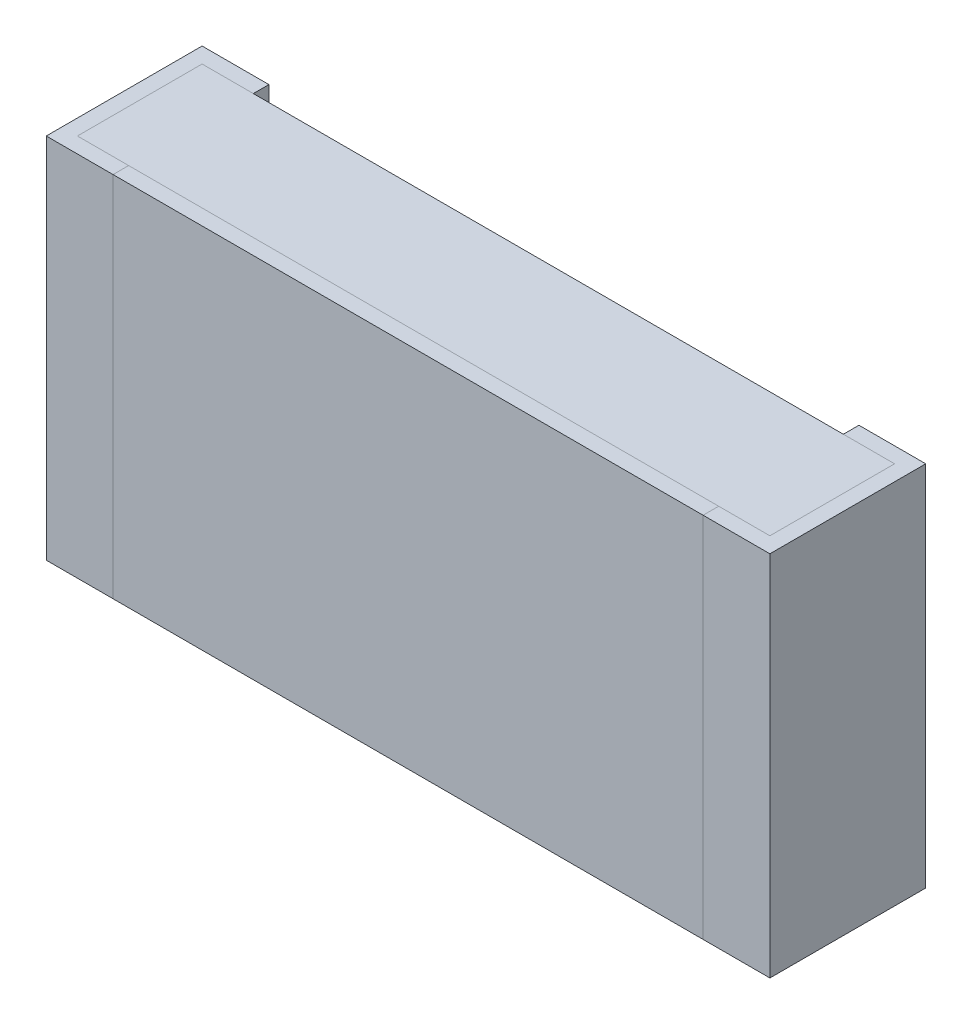
ISO-10303-21;
HEADER;
FILE_DESCRIPTION(('STEP AP214'),'2;1');
FILE_NAME('part.step','',(''),(''),'','','');
FILE_SCHEMA(('AUTOMOTIVE_DESIGN { 1 0 10303 214 1 1 1 1 }'));
ENDSEC;
DATA;
#1=APPLICATION_CONTEXT('core data for automotive mechanical design processes');
#2=APPLICATION_PROTOCOL_DEFINITION('international standard','automotive_design',2000,#1);
#3=PRODUCT_CONTEXT('',#1,'mechanical');
#4=PRODUCT('Part','Part','',(#3));
#5=PRODUCT_RELATED_PRODUCT_CATEGORY('part','',(#4));
#6=PRODUCT_DEFINITION_FORMATION('','',#4);
#7=PRODUCT_DEFINITION_CONTEXT('part definition',#1,'design');
#8=PRODUCT_DEFINITION('design','',#6,#7);
#9=PRODUCT_DEFINITION_SHAPE('','',#8);
#10=(LENGTH_UNIT() NAMED_UNIT(*) SI_UNIT(.MILLI.,.METRE.));
#11=(NAMED_UNIT(*) PLANE_ANGLE_UNIT() SI_UNIT($,.RADIAN.));
#12=(NAMED_UNIT(*) SI_UNIT($,.STERADIAN.) SOLID_ANGLE_UNIT());
#13=UNCERTAINTY_MEASURE_WITH_UNIT(LENGTH_MEASURE(1.E-05),#10,'distance_accuracy_value','');
#14=(GEOMETRIC_REPRESENTATION_CONTEXT(3) GLOBAL_UNCERTAINTY_ASSIGNED_CONTEXT((#13)) GLOBAL_UNIT_ASSIGNED_CONTEXT((#10,
#11,#12)) REPRESENTATION_CONTEXT('',''));
#15=CARTESIAN_POINT('',(0.,0.,0.));
#16=DIRECTION('',(0.,0.,1.));
#17=DIRECTION('',(1.,0.,0.));
#18=AXIS2_PLACEMENT_3D('',#15,#16,#17);
#19=CARTESIAN_POINT('',(-1.55483744,-0.900915519999999,0.07));
#20=DIRECTION('',(1.,0.,0.));
#21=DIRECTION('',(0.,0.,1.));
#22=AXIS2_PLACEMENT_3D('',#19,#20,#21);
#23=PLANE('',#22);
#24=DIRECTION('',(0.,1.,0.));
#25=VECTOR('',#24,1.);
#26=CARTESIAN_POINT('',(-1.55483744,-0.900915519999999,0.63));
#27=LINE('',#26,#25);
#28=CARTESIAN_POINT('',(-1.55483744,-0.900915519999999,0.63));
#29=VERTEX_POINT('',#28);
#30=CARTESIAN_POINT('',(-1.55483744,0.74908448,0.63));
#31=VERTEX_POINT('',#30);
#32=EDGE_CURVE('P0_E11',#29,#31,#27,.T.);
#33=ORIENTED_EDGE('',*,*,#32,.T.);
#34=DIRECTION('',(0.,0.,1.));
#35=VECTOR('',#34,1.);
#36=CARTESIAN_POINT('',(-1.55483744,0.74908448,0.07));
#37=LINE('',#36,#35);
#38=CARTESIAN_POINT('',(-1.55483744,0.74908448,0.07));
#39=VERTEX_POINT('',#38);
#40=EDGE_CURVE('P0_E24',#39,#31,#37,.T.);
#41=ORIENTED_EDGE('',*,*,#40,.F.);
#42=DIRECTION('',(0.,1.,0.));
#43=VECTOR('',#42,1.);
#44=CARTESIAN_POINT('',(-1.55483744,-0.900915519999999,0.07));
#45=LINE('',#44,#43);
#46=CARTESIAN_POINT('',(-1.55483744,-0.900915519999999,0.07));
#47=VERTEX_POINT('',#46);
#48=EDGE_CURVE('P0_E86',#47,#39,#45,.T.);
#49=ORIENTED_EDGE('',*,*,#48,.F.);
#50=DIRECTION('',(0.,0.,1.));
#51=VECTOR('',#50,1.);
#52=CARTESIAN_POINT('',(-1.55483744,-0.900915519999999,0.07));
#53=LINE('',#52,#51);
#54=EDGE_CURVE('P0_E36',#47,#29,#53,.T.);
#55=ORIENTED_EDGE('',*,*,#54,.T.);
#56=EDGE_LOOP('',(#33,#41,#49,#55));
#57=FACE_BOUND('',#56,.T.);
#58=ADVANCED_FACE('P0_F17',(#57),#23,.F.);
#59=CARTESIAN_POINT('',(1.55516256,-0.90091552,0.07));
#60=DIRECTION('',(1.,0.,0.));
#61=DIRECTION('',(0.,0.,1.));
#62=AXIS2_PLACEMENT_3D('',#59,#60,#61);
#63=PLANE('',#62);
#64=DIRECTION('',(0.,0.,1.));
#65=VECTOR('',#64,1.);
#66=CARTESIAN_POINT('',(1.55516256,-0.90091552,0.07));
#67=LINE('',#66,#65);
#68=CARTESIAN_POINT('',(1.55516256,-0.90091552,0.07));
#69=VERTEX_POINT('',#68);
#70=CARTESIAN_POINT('',(1.55516256,-0.90091552,0.63));
#71=VERTEX_POINT('',#70);
#72=EDGE_CURVE('P0_E83',#69,#71,#67,.T.);
#73=ORIENTED_EDGE('',*,*,#72,.F.);
#74=DIRECTION('',(0.,1.,0.));
#75=VECTOR('',#74,1.);
#76=CARTESIAN_POINT('',(1.55516256,-0.90091552,0.07));
#77=LINE('',#76,#75);
#78=CARTESIAN_POINT('',(1.55516256,0.74908448,0.07));
#79=VERTEX_POINT('',#78);
#80=EDGE_CURVE('P0_E63',#69,#79,#77,.T.);
#81=ORIENTED_EDGE('',*,*,#80,.T.);
#82=DIRECTION('',(0.,0.,1.));
#83=VECTOR('',#82,1.);
#84=CARTESIAN_POINT('',(1.55516256,0.74908448,0.07));
#85=LINE('',#84,#83);
#86=CARTESIAN_POINT('',(1.55516256,0.74908448,0.63));
#87=VERTEX_POINT('',#86);
#88=EDGE_CURVE('P0_E57',#79,#87,#85,.T.);
#89=ORIENTED_EDGE('',*,*,#88,.T.);
#90=DIRECTION('',(0.,1.,0.));
#91=VECTOR('',#90,1.);
#92=CARTESIAN_POINT('',(1.55516256,-0.90091552,0.63));
#93=LINE('',#92,#91);
#94=EDGE_CURVE('P0_E60',#71,#87,#93,.T.);
#95=ORIENTED_EDGE('',*,*,#94,.F.);
#96=EDGE_LOOP('',(#73,#81,#89,#95));
#97=FACE_BOUND('',#96,.T.);
#98=ADVANCED_FACE('P0_F59',(#97),#63,.T.);
#99=CARTESIAN_POINT('',(-1.55483744,-0.900915519999999,0.07));
#100=DIRECTION('',(0.,1.,0.));
#101=DIRECTION('',(0.,0.,1.));
#102=AXIS2_PLACEMENT_3D('',#99,#100,#101);
#103=PLANE('',#102);
#104=ORIENTED_EDGE('',*,*,#72,.T.);
#105=DIRECTION('',(1.,0.,0.));
#106=VECTOR('',#105,1.);
#107=CARTESIAN_POINT('',(-1.55483744,-0.900915519999999,0.63));
#108=LINE('',#107,#106);
#109=EDGE_CURVE('P0_E71',#29,#71,#108,.T.);
#110=ORIENTED_EDGE('',*,*,#109,.F.);
#111=ORIENTED_EDGE('',*,*,#54,.F.);
#112=DIRECTION('',(1.,0.,0.));
#113=VECTOR('',#112,1.);
#114=CARTESIAN_POINT('',(-1.55483744,-0.900915519999999,0.07));
#115=LINE('',#114,#113);
#116=EDGE_CURVE('P0_E76',#47,#69,#115,.T.);
#117=ORIENTED_EDGE('',*,*,#116,.T.);
#118=EDGE_LOOP('',(#104,#110,#111,#117));
#119=FACE_BOUND('',#118,.T.);
#120=ADVANCED_FACE('P0_F91',(#119),#103,.F.);
#121=CARTESIAN_POINT('',(-1.55483744,0.74908448,0.07));
#122=DIRECTION('',(0.,1.,0.));
#123=DIRECTION('',(0.,0.,1.));
#124=AXIS2_PLACEMENT_3D('',#121,#122,#123);
#125=PLANE('',#124);
#126=DIRECTION('',(1.,0.,0.));
#127=VECTOR('',#126,1.);
#128=CARTESIAN_POINT('',(-1.55483744,0.74908448,0.07));
#129=LINE('',#128,#127);
#130=EDGE_CURVE('P0_E74',#39,#79,#129,.T.);
#131=ORIENTED_EDGE('',*,*,#130,.F.);
#132=ORIENTED_EDGE('',*,*,#40,.T.);
#133=DIRECTION('',(1.,0.,0.));
#134=VECTOR('',#133,1.);
#135=CARTESIAN_POINT('',(-1.55483744,0.74908448,0.63));
#136=LINE('',#135,#134);
#137=EDGE_CURVE('P0_E69',#31,#87,#136,.T.);
#138=ORIENTED_EDGE('',*,*,#137,.T.);
#139=ORIENTED_EDGE('',*,*,#88,.F.);
#140=EDGE_LOOP('',(#131,#132,#138,#139));
#141=FACE_BOUND('',#140,.T.);
#142=ADVANCED_FACE('P0_F73',(#141),#125,.T.);
#143=CARTESIAN_POINT('',(-1.55483744,-0.900915519999999,0.07));
#144=DIRECTION('',(0.,0.,1.));
#145=DIRECTION('',(1.,0.,0.));
#146=AXIS2_PLACEMENT_3D('',#143,#144,#145);
#147=PLANE('',#146);
#148=ORIENTED_EDGE('',*,*,#130,.T.);
#149=ORIENTED_EDGE('',*,*,#80,.F.);
#150=ORIENTED_EDGE('',*,*,#116,.F.);
#151=ORIENTED_EDGE('',*,*,#48,.T.);
#152=EDGE_LOOP('',(#148,#149,#150,#151));
#153=FACE_BOUND('',#152,.T.);
#154=ADVANCED_FACE('P0_F89',(#153),#147,.F.);
#155=CARTESIAN_POINT('',(-1.55483744,-0.900915519999999,0.63));
#156=DIRECTION('',(0.,0.,1.));
#157=DIRECTION('',(1.,0.,0.));
#158=AXIS2_PLACEMENT_3D('',#155,#156,#157);
#159=PLANE('',#158);
#160=ORIENTED_EDGE('',*,*,#32,.F.);
#161=ORIENTED_EDGE('',*,*,#109,.T.);
#162=ORIENTED_EDGE('',*,*,#94,.T.);
#163=ORIENTED_EDGE('',*,*,#137,.F.);
#164=EDGE_LOOP('',(#160,#161,#162,#163));
#165=FACE_BOUND('',#164,.T.);
#166=ADVANCED_FACE('P0_F68',(#165),#159,.T.);
#167=CLOSED_SHELL('',(#58,#98,#120,#142,#154,#166));
#168=MANIFOLD_SOLID_BREP('P0_B1',#167);
#169=CARTESIAN_POINT('',(-1.62483744,-0.900915519999999,0.));
#170=DIRECTION('',(1.,0.,0.));
#171=DIRECTION('',(0.,0.,1.));
#172=AXIS2_PLACEMENT_3D('',#169,#170,#171);
#173=PLANE('',#172);
#174=DIRECTION('',(0.,1.,0.));
#175=VECTOR('',#174,1.);
#176=CARTESIAN_POINT('',(-1.62483744,-0.900915519999999,0.7));
#177=LINE('',#176,#175);
#178=CARTESIAN_POINT('',(-1.62483744,-0.900915519999999,0.7));
#179=VERTEX_POINT('',#178);
#180=CARTESIAN_POINT('',(-1.62483744,0.74908448,0.7));
#181=VERTEX_POINT('',#180);
#182=EDGE_CURVE('P1_E11',#179,#181,#177,.T.);
#183=ORIENTED_EDGE('',*,*,#182,.T.);
#184=DIRECTION('',(0.,0.,1.));
#185=VECTOR('',#184,1.);
#186=CARTESIAN_POINT('',(-1.62483744,0.74908448,0.));
#187=LINE('',#186,#185);
#188=CARTESIAN_POINT('',(-1.62483744,0.74908448,0.));
#189=VERTEX_POINT('',#188);
#190=EDGE_CURVE('P1_E24',#189,#181,#187,.T.);
#191=ORIENTED_EDGE('',*,*,#190,.F.);
#192=DIRECTION('',(0.,1.,0.));
#193=VECTOR('',#192,1.);
#194=CARTESIAN_POINT('',(-1.62483744,-0.900915519999999,0.));
#195=LINE('',#194,#193);
#196=CARTESIAN_POINT('',(-1.62483744,-0.900915519999999,0.));
#197=VERTEX_POINT('',#196);
#198=EDGE_CURVE('P1_E138',#197,#189,#195,.T.);
#199=ORIENTED_EDGE('',*,*,#198,.F.);
#200=DIRECTION('',(0.,0.,1.));
#201=VECTOR('',#200,1.);
#202=CARTESIAN_POINT('',(-1.62483744,-0.900915519999999,0.));
#203=LINE('',#202,#201);
#204=EDGE_CURVE('P1_E37',#197,#179,#203,.T.);
#205=ORIENTED_EDGE('',*,*,#204,.T.);
#206=EDGE_LOOP('',(#183,#191,#199,#205));
#207=FACE_BOUND('',#206,.T.);
#208=ADVANCED_FACE('P1_F17',(#207),#173,.F.);
#209=CARTESIAN_POINT('',(-1.62483744,-0.900915519999999,0.));
#210=DIRECTION('',(0.,1.,0.));
#211=DIRECTION('',(0.,0.,1.));
#212=AXIS2_PLACEMENT_3D('',#209,#210,#211);
#213=PLANE('',#212);
#214=DIRECTION('',(1.,0.,0.));
#215=VECTOR('',#214,1.);
#216=CARTESIAN_POINT('',(-1.55483744,-0.900915519999999,0.07));
#217=LINE('',#216,#215);
#218=CARTESIAN_POINT('',(-1.55483744,-0.900915519999999,0.07));
#219=VERTEX_POINT('',#218);
#220=CARTESIAN_POINT('',(-1.32483744,-0.90091552,0.07));
#221=VERTEX_POINT('',#220);
#222=EDGE_CURVE('P1_E135',#219,#221,#217,.T.);
#223=ORIENTED_EDGE('',*,*,#222,.F.);
#224=DIRECTION('',(0.,0.,1.));
#225=VECTOR('',#224,1.);
#226=CARTESIAN_POINT('',(-1.55483744,-0.900915519999999,0.07));
#227=LINE('',#226,#225);
#228=CARTESIAN_POINT('',(-1.55483744,-0.900915519999999,0.63));
#229=VERTEX_POINT('',#228);
#230=EDGE_CURVE('P1_E98',#219,#229,#227,.T.);
#231=ORIENTED_EDGE('',*,*,#230,.T.);
#232=DIRECTION('',(1.,0.,0.));
#233=VECTOR('',#232,1.);
#234=CARTESIAN_POINT('',(-1.55483744,-0.900915519999999,0.63));
#235=LINE('',#234,#233);
#236=CARTESIAN_POINT('',(-1.32483744,-0.90091552,0.63));
#237=VERTEX_POINT('',#236);
#238=EDGE_CURVE('P1_E131',#229,#237,#235,.T.);
#239=ORIENTED_EDGE('',*,*,#238,.T.);
#240=DIRECTION('',(0.,0.,1.));
#241=VECTOR('',#240,1.);
#242=CARTESIAN_POINT('',(-1.32483744,-0.90091552,0.));
#243=LINE('',#242,#241);
#244=CARTESIAN_POINT('',(-1.32483744,-0.90091552,0.7));
#245=VERTEX_POINT('',#244);
#246=EDGE_CURVE('P1_E128',#237,#245,#243,.T.);
#247=ORIENTED_EDGE('',*,*,#246,.T.);
#248=DIRECTION('',(1.,0.,0.));
#249=VECTOR('',#248,1.);
#250=CARTESIAN_POINT('',(-1.62483744,-0.900915519999999,0.7));
#251=LINE('',#250,#249);
#252=EDGE_CURVE('P1_E126',#179,#245,#251,.T.);
#253=ORIENTED_EDGE('',*,*,#252,.F.);
#254=ORIENTED_EDGE('',*,*,#204,.F.);
#255=DIRECTION('',(1.,0.,0.));
#256=VECTOR('',#255,1.);
#257=CARTESIAN_POINT('',(-1.62483744,-0.900915519999999,0.));
#258=LINE('',#257,#256);
#259=CARTESIAN_POINT('',(-1.32483744,-0.90091552,0.));
#260=VERTEX_POINT('',#259);
#261=EDGE_CURVE('P1_E123',#197,#260,#258,.T.);
#262=ORIENTED_EDGE('',*,*,#261,.T.);
#263=DIRECTION('',(0.,0.,1.));
#264=VECTOR('',#263,1.);
#265=CARTESIAN_POINT('',(-1.32483744,-0.90091552,0.));
#266=LINE('',#265,#264);
#267=EDGE_CURVE('P1_E121',#260,#221,#266,.T.);
#268=ORIENTED_EDGE('',*,*,#267,.T.);
#269=EDGE_LOOP('',(#223,#231,#239,#247,#253,#254,#262,#268));
#270=FACE_BOUND('',#269,.T.);
#271=ADVANCED_FACE('P1_F146',(#270),#213,.F.);
#272=CARTESIAN_POINT('',(-1.62483744,-0.900915519999999,0.7));
#273=DIRECTION('',(0.,0.,1.));
#274=DIRECTION('',(1.,0.,0.));
#275=AXIS2_PLACEMENT_3D('',#272,#273,#274);
#276=PLANE('',#275);
#277=ORIENTED_EDGE('',*,*,#182,.F.);
#278=ORIENTED_EDGE('',*,*,#252,.T.);
#279=DIRECTION('',(0.,1.,0.));
#280=VECTOR('',#279,1.);
#281=CARTESIAN_POINT('',(-1.32483744,-0.90091552,0.7));
#282=LINE('',#281,#280);
#283=CARTESIAN_POINT('',(-1.32483744,0.74908448,0.7));
#284=VERTEX_POINT('',#283);
#285=EDGE_CURVE('P1_E119',#245,#284,#282,.T.);
#286=ORIENTED_EDGE('',*,*,#285,.T.);
#287=DIRECTION('',(1.,0.,0.));
#288=VECTOR('',#287,1.);
#289=CARTESIAN_POINT('',(-1.62483744,0.74908448,0.7));
#290=LINE('',#289,#288);
#291=EDGE_CURVE('P1_E31',#181,#284,#290,.T.);
#292=ORIENTED_EDGE('',*,*,#291,.F.);
#293=EDGE_LOOP('',(#277,#278,#286,#292));
#294=FACE_BOUND('',#293,.T.);
#295=ADVANCED_FACE('P1_F143',(#294),#276,.T.);
#296=CARTESIAN_POINT('',(-1.62483744,0.74908448,0.));
#297=DIRECTION('',(0.,1.,0.));
#298=DIRECTION('',(0.,0.,1.));
#299=AXIS2_PLACEMENT_3D('',#296,#297,#298);
#300=PLANE('',#299);
#301=DIRECTION('',(0.,0.,1.));
#302=VECTOR('',#301,1.);
#303=CARTESIAN_POINT('',(-1.32483744,0.74908448,0.));
#304=LINE('',#303,#302);
#305=CARTESIAN_POINT('',(-1.32483744,0.74908448,0.));
#306=VERTEX_POINT('',#305);
#307=CARTESIAN_POINT('',(-1.32483744,0.74908448,0.07));
#308=VERTEX_POINT('',#307);
#309=EDGE_CURVE('P1_E116',#306,#308,#304,.T.);
#310=ORIENTED_EDGE('',*,*,#309,.F.);
#311=DIRECTION('',(1.,0.,0.));
#312=VECTOR('',#311,1.);
#313=CARTESIAN_POINT('',(-1.62483744,0.74908448,0.));
#314=LINE('',#313,#312);
#315=EDGE_CURVE('P1_E113',#189,#306,#314,.T.);
#316=ORIENTED_EDGE('',*,*,#315,.F.);
#317=ORIENTED_EDGE('',*,*,#190,.T.);
#318=ORIENTED_EDGE('',*,*,#291,.T.);
#319=DIRECTION('',(0.,0.,1.));
#320=VECTOR('',#319,1.);
#321=CARTESIAN_POINT('',(-1.32483744,0.74908448,0.));
#322=LINE('',#321,#320);
#323=CARTESIAN_POINT('',(-1.32483744,0.74908448,0.63));
#324=VERTEX_POINT('',#323);
#325=EDGE_CURVE('P1_E107',#324,#284,#322,.T.);
#326=ORIENTED_EDGE('',*,*,#325,.F.);
#327=DIRECTION('',(1.,0.,0.));
#328=VECTOR('',#327,1.);
#329=CARTESIAN_POINT('',(-1.55483744,0.74908448,0.63));
#330=LINE('',#329,#328);
#331=CARTESIAN_POINT('',(-1.55483744,0.74908448,0.63));
#332=VERTEX_POINT('',#331);
#333=EDGE_CURVE('P1_E104',#332,#324,#330,.T.);
#334=ORIENTED_EDGE('',*,*,#333,.F.);
#335=DIRECTION('',(0.,0.,1.));
#336=VECTOR('',#335,1.);
#337=CARTESIAN_POINT('',(-1.55483744,0.74908448,0.07));
#338=LINE('',#337,#336);
#339=CARTESIAN_POINT('',(-1.55483744,0.74908448,0.07));
#340=VERTEX_POINT('',#339);
#341=EDGE_CURVE('P1_E91',#340,#332,#338,.T.);
#342=ORIENTED_EDGE('',*,*,#341,.F.);
#343=DIRECTION('',(1.,0.,0.));
#344=VECTOR('',#343,1.);
#345=CARTESIAN_POINT('',(-1.55483744,0.74908448,0.07));
#346=LINE('',#345,#344);
#347=EDGE_CURVE('P1_E82',#340,#308,#346,.T.);
#348=ORIENTED_EDGE('',*,*,#347,.T.);
#349=EDGE_LOOP('',(#310,#316,#317,#318,#326,#334,#342,#348));
#350=FACE_BOUND('',#349,.T.);
#351=ADVANCED_FACE('P1_F102',(#350),#300,.T.);
#352=CARTESIAN_POINT('',(-1.62483744,-0.900915519999999,0.));
#353=DIRECTION('',(0.,0.,1.));
#354=DIRECTION('',(1.,0.,0.));
#355=AXIS2_PLACEMENT_3D('',#352,#353,#354);
#356=PLANE('',#355);
#357=ORIENTED_EDGE('',*,*,#315,.T.);
#358=DIRECTION('',(0.,1.,0.));
#359=VECTOR('',#358,1.);
#360=CARTESIAN_POINT('',(-1.32483744,-0.90091552,0.));
#361=LINE('',#360,#359);
#362=EDGE_CURVE('P1_E92',#260,#306,#361,.T.);
#363=ORIENTED_EDGE('',*,*,#362,.F.);
#364=ORIENTED_EDGE('',*,*,#261,.F.);
#365=ORIENTED_EDGE('',*,*,#198,.T.);
#366=EDGE_LOOP('',(#357,#363,#364,#365));
#367=FACE_BOUND('',#366,.T.);
#368=ADVANCED_FACE('P1_F162',(#367),#356,.F.);
#369=CARTESIAN_POINT('',(-1.32483744,-0.90091552,0.));
#370=DIRECTION('',(1.,0.,0.));
#371=DIRECTION('',(0.,0.,1.));
#372=AXIS2_PLACEMENT_3D('',#369,#370,#371);
#373=PLANE('',#372);
#374=ORIENTED_EDGE('',*,*,#267,.F.);
#375=ORIENTED_EDGE('',*,*,#362,.T.);
#376=ORIENTED_EDGE('',*,*,#309,.T.);
#377=DIRECTION('',(0.,-1.,0.));
#378=VECTOR('',#377,1.);
#379=CARTESIAN_POINT('',(-1.32483744,-0.90091552,0.07));
#380=LINE('',#379,#378);
#381=EDGE_CURVE('P1_E88',#308,#221,#380,.T.);
#382=ORIENTED_EDGE('',*,*,#381,.T.);
#383=EDGE_LOOP('',(#374,#375,#376,#382));
#384=FACE_BOUND('',#383,.T.);
#385=ADVANCED_FACE('P1_F160',(#384),#373,.T.);
#386=CARTESIAN_POINT('',(-1.55483744,-0.900915519999999,0.07));
#387=DIRECTION('',(0.,0.,1.));
#388=DIRECTION('',(1.,0.,0.));
#389=AXIS2_PLACEMENT_3D('',#386,#387,#388);
#390=PLANE('',#389);
#391=ORIENTED_EDGE('',*,*,#347,.F.);
#392=DIRECTION('',(0.,1.,0.));
#393=VECTOR('',#392,1.);
#394=CARTESIAN_POINT('',(-1.55483744,-0.900915519999999,0.07));
#395=LINE('',#394,#393);
#396=EDGE_CURVE('P1_E86',#219,#340,#395,.T.);
#397=ORIENTED_EDGE('',*,*,#396,.F.);
#398=ORIENTED_EDGE('',*,*,#222,.T.);
#399=ORIENTED_EDGE('',*,*,#381,.F.);
#400=EDGE_LOOP('',(#391,#397,#398,#399));
#401=FACE_BOUND('',#400,.T.);
#402=ADVANCED_FACE('P1_F84',(#401),#390,.T.);
#403=CARTESIAN_POINT('',(-1.55483744,-0.900915519999999,0.07));
#404=DIRECTION('',(1.,0.,0.));
#405=DIRECTION('',(0.,0.,1.));
#406=AXIS2_PLACEMENT_3D('',#403,#404,#405);
#407=PLANE('',#406);
#408=ORIENTED_EDGE('',*,*,#230,.F.);
#409=ORIENTED_EDGE('',*,*,#396,.T.);
#410=ORIENTED_EDGE('',*,*,#341,.T.);
#411=DIRECTION('',(0.,1.,0.));
#412=VECTOR('',#411,1.);
#413=CARTESIAN_POINT('',(-1.55483744,-0.900915519999999,0.63));
#414=LINE('',#413,#412);
#415=EDGE_CURVE('P1_E100',#229,#332,#414,.T.);
#416=ORIENTED_EDGE('',*,*,#415,.F.);
#417=EDGE_LOOP('',(#408,#409,#410,#416));
#418=FACE_BOUND('',#417,.T.);
#419=ADVANCED_FACE('P1_F96',(#418),#407,.T.);
#420=CARTESIAN_POINT('',(-1.55483744,-0.900915519999999,0.63));
#421=DIRECTION('',(0.,0.,1.));
#422=DIRECTION('',(1.,0.,0.));
#423=AXIS2_PLACEMENT_3D('',#420,#421,#422);
#424=PLANE('',#423);
#425=DIRECTION('',(0.,-1.,0.));
#426=VECTOR('',#425,1.);
#427=CARTESIAN_POINT('',(-1.32483744,-0.90091552,0.63));
#428=LINE('',#427,#426);
#429=EDGE_CURVE('P1_E152',#324,#237,#428,.T.);
#430=ORIENTED_EDGE('',*,*,#429,.T.);
#431=ORIENTED_EDGE('',*,*,#238,.F.);
#432=ORIENTED_EDGE('',*,*,#415,.T.);
#433=ORIENTED_EDGE('',*,*,#333,.T.);
#434=EDGE_LOOP('',(#430,#431,#432,#433));
#435=FACE_BOUND('',#434,.T.);
#436=ADVANCED_FACE('P1_F163',(#435),#424,.F.);
#437=CARTESIAN_POINT('',(-1.32483744,-0.90091552,0.));
#438=DIRECTION('',(1.,0.,0.));
#439=DIRECTION('',(0.,0.,1.));
#440=AXIS2_PLACEMENT_3D('',#437,#438,#439);
#441=PLANE('',#440);
#442=ORIENTED_EDGE('',*,*,#246,.F.);
#443=ORIENTED_EDGE('',*,*,#429,.F.);
#444=ORIENTED_EDGE('',*,*,#325,.T.);
#445=ORIENTED_EDGE('',*,*,#285,.F.);
#446=EDGE_LOOP('',(#442,#443,#444,#445));
#447=FACE_BOUND('',#446,.T.);
#448=ADVANCED_FACE('P1_F151',(#447),#441,.T.);
#449=CLOSED_SHELL('',(#208,#271,#295,#351,#368,#385,#402,#419,#436,#448));
#450=MANIFOLD_SOLID_BREP('P1_B1',#449);
#451=CARTESIAN_POINT('',(1.62516256,0.74908448,0.));
#452=DIRECTION('',(-1.,0.,0.));
#453=DIRECTION('',(0.,0.,1.));
#454=AXIS2_PLACEMENT_3D('',#451,#452,#453);
#455=PLANE('',#454);
#456=DIRECTION('',(0.,-1.,0.));
#457=VECTOR('',#456,1.);
#458=CARTESIAN_POINT('',(1.62516256,0.74908448,0.7));
#459=LINE('',#458,#457);
#460=CARTESIAN_POINT('',(1.62516256,0.74908448,0.7));
#461=VERTEX_POINT('',#460);
#462=CARTESIAN_POINT('',(1.62516256,-0.900915520000001,0.7));
#463=VERTEX_POINT('',#462);
#464=EDGE_CURVE('P2_E11',#461,#463,#459,.T.);
#465=ORIENTED_EDGE('',*,*,#464,.T.);
#466=DIRECTION('',(0.,0.,1.));
#467=VECTOR('',#466,1.);
#468=CARTESIAN_POINT('',(1.62516256,-0.900915520000001,0.));
#469=LINE('',#468,#467);
#470=CARTESIAN_POINT('',(1.62516256,-0.900915520000001,0.));
#471=VERTEX_POINT('',#470);
#472=EDGE_CURVE('P2_E24',#471,#463,#469,.T.);
#473=ORIENTED_EDGE('',*,*,#472,.F.);
#474=DIRECTION('',(0.,-1.,0.));
#475=VECTOR('',#474,1.);
#476=CARTESIAN_POINT('',(1.62516256,0.74908448,0.));
#477=LINE('',#476,#475);
#478=CARTESIAN_POINT('',(1.62516256,0.74908448,0.));
#479=VERTEX_POINT('',#478);
#480=EDGE_CURVE('P2_E143',#479,#471,#477,.T.);
#481=ORIENTED_EDGE('',*,*,#480,.F.);
#482=DIRECTION('',(0.,0.,1.));
#483=VECTOR('',#482,1.);
#484=CARTESIAN_POINT('',(1.62516256,0.74908448,0.));
#485=LINE('',#484,#483);
#486=EDGE_CURVE('P2_E38',#479,#461,#485,.T.);
#487=ORIENTED_EDGE('',*,*,#486,.T.);
#488=EDGE_LOOP('',(#465,#473,#481,#487));
#489=FACE_BOUND('',#488,.T.);
#490=ADVANCED_FACE('P2_F17',(#489),#455,.F.);
#491=CARTESIAN_POINT('',(1.62516256,0.74908448,0.));
#492=DIRECTION('',(0.,-1.,0.));
#493=DIRECTION('',(0.,0.,1.));
#494=AXIS2_PLACEMENT_3D('',#491,#492,#493);
#495=PLANE('',#494);
#496=DIRECTION('',(-1.,0.,0.));
#497=VECTOR('',#496,1.);
#498=CARTESIAN_POINT('',(1.55516256,0.74908448,0.07));
#499=LINE('',#498,#497);
#500=CARTESIAN_POINT('',(1.55516256,0.74908448,0.07));
#501=VERTEX_POINT('',#500);
#502=CARTESIAN_POINT('',(1.32516256,0.74908448,0.07));
#503=VERTEX_POINT('',#502);
#504=EDGE_CURVE('P2_E140',#501,#503,#499,.T.);
#505=ORIENTED_EDGE('',*,*,#504,.F.);
#506=DIRECTION('',(0.,0.,1.));
#507=VECTOR('',#506,1.);
#508=CARTESIAN_POINT('',(1.55516256,0.74908448,0.07));
#509=LINE('',#508,#507);
#510=CARTESIAN_POINT('',(1.55516256,0.74908448,0.63));
#511=VERTEX_POINT('',#510);
#512=EDGE_CURVE('P2_E103',#501,#511,#509,.T.);
#513=ORIENTED_EDGE('',*,*,#512,.T.);
#514=DIRECTION('',(-1.,0.,0.));
#515=VECTOR('',#514,1.);
#516=CARTESIAN_POINT('',(1.55516256,0.74908448,0.63));
#517=LINE('',#516,#515);
#518=CARTESIAN_POINT('',(1.32516256,0.74908448,0.63));
#519=VERTEX_POINT('',#518);
#520=EDGE_CURVE('P2_E136',#511,#519,#517,.T.);
#521=ORIENTED_EDGE('',*,*,#520,.T.);
#522=DIRECTION('',(0.,0.,1.));
#523=VECTOR('',#522,1.);
#524=CARTESIAN_POINT('',(1.32516256,0.74908448,0.));
#525=LINE('',#524,#523);
#526=CARTESIAN_POINT('',(1.32516256,0.74908448,0.7));
#527=VERTEX_POINT('',#526);
#528=EDGE_CURVE('P2_E133',#519,#527,#525,.T.);
#529=ORIENTED_EDGE('',*,*,#528,.T.);
#530=DIRECTION('',(-1.,0.,0.));
#531=VECTOR('',#530,1.);
#532=CARTESIAN_POINT('',(1.62516256,0.74908448,0.7));
#533=LINE('',#532,#531);
#534=EDGE_CURVE('P2_E131',#461,#527,#533,.T.);
#535=ORIENTED_EDGE('',*,*,#534,.F.);
#536=ORIENTED_EDGE('',*,*,#486,.F.);
#537=DIRECTION('',(-1.,0.,0.));
#538=VECTOR('',#537,1.);
#539=CARTESIAN_POINT('',(1.62516256,0.74908448,0.));
#540=LINE('',#539,#538);
#541=CARTESIAN_POINT('',(1.32516256,0.74908448,0.));
#542=VERTEX_POINT('',#541);
#543=EDGE_CURVE('P2_E128',#479,#542,#540,.T.);
#544=ORIENTED_EDGE('',*,*,#543,.T.);
#545=DIRECTION('',(0.,0.,1.));
#546=VECTOR('',#545,1.);
#547=CARTESIAN_POINT('',(1.32516256,0.74908448,0.));
#548=LINE('',#547,#546);
#549=EDGE_CURVE('P2_E126',#542,#503,#548,.T.);
#550=ORIENTED_EDGE('',*,*,#549,.T.);
#551=EDGE_LOOP('',(#505,#513,#521,#529,#535,#536,#544,#550));
#552=FACE_BOUND('',#551,.T.);
#553=ADVANCED_FACE('P2_F149',(#552),#495,.F.);
#554=CARTESIAN_POINT('',(1.62516256,0.74908448,0.7));
#555=DIRECTION('',(0.,0.,1.));
#556=DIRECTION('',(-1.,0.,0.));
#557=AXIS2_PLACEMENT_3D('',#554,#555,#556);
#558=PLANE('',#557);
#559=ORIENTED_EDGE('',*,*,#464,.F.);
#560=ORIENTED_EDGE('',*,*,#534,.T.);
#561=DIRECTION('',(0.,-1.,0.));
#562=VECTOR('',#561,1.);
#563=CARTESIAN_POINT('',(1.32516256,0.74908448,0.7));
#564=LINE('',#563,#562);
#565=CARTESIAN_POINT('',(1.32516256,-0.900915520000001,0.7));
#566=VERTEX_POINT('',#565);
#567=EDGE_CURVE('P2_E124',#527,#566,#564,.T.);
#568=ORIENTED_EDGE('',*,*,#567,.T.);
#569=DIRECTION('',(-1.,0.,0.));
#570=VECTOR('',#569,1.);
#571=CARTESIAN_POINT('',(1.62516256,-0.900915520000001,0.7));
#572=LINE('',#571,#570);
#573=EDGE_CURVE('P2_E31',#463,#566,#572,.T.);
#574=ORIENTED_EDGE('',*,*,#573,.F.);
#575=EDGE_LOOP('',(#559,#560,#568,#574));
#576=FACE_BOUND('',#575,.T.);
#577=ADVANCED_FACE('P2_F147',(#576),#558,.T.);
#578=CARTESIAN_POINT('',(1.62516256,-0.900915520000001,0.));
#579=DIRECTION('',(0.,-1.,0.));
#580=DIRECTION('',(0.,0.,1.));
#581=AXIS2_PLACEMENT_3D('',#578,#579,#580);
#582=PLANE('',#581);
#583=DIRECTION('',(0.,0.,1.));
#584=VECTOR('',#583,1.);
#585=CARTESIAN_POINT('',(1.32516256,-0.900915520000001,0.));
#586=LINE('',#585,#584);
#587=CARTESIAN_POINT('',(1.32516256,-0.900915520000001,0.));
#588=VERTEX_POINT('',#587);
#589=CARTESIAN_POINT('',(1.32516256,-0.900915520000001,0.07));
#590=VERTEX_POINT('',#589);
#591=EDGE_CURVE('P2_E121',#588,#590,#586,.T.);
#592=ORIENTED_EDGE('',*,*,#591,.F.);
#593=DIRECTION('',(-1.,0.,0.));
#594=VECTOR('',#593,1.);
#595=CARTESIAN_POINT('',(1.62516256,-0.900915520000001,0.));
#596=LINE('',#595,#594);
#597=EDGE_CURVE('P2_E118',#471,#588,#596,.T.);
#598=ORIENTED_EDGE('',*,*,#597,.F.);
#599=ORIENTED_EDGE('',*,*,#472,.T.);
#600=ORIENTED_EDGE('',*,*,#573,.T.);
#601=DIRECTION('',(0.,0.,1.));
#602=VECTOR('',#601,1.);
#603=CARTESIAN_POINT('',(1.32516256,-0.900915520000001,0.));
#604=LINE('',#603,#602);
#605=CARTESIAN_POINT('',(1.32516256,-0.900915520000001,0.63));
#606=VERTEX_POINT('',#605);
#607=EDGE_CURVE('P2_E115',#606,#566,#604,.T.);
#608=ORIENTED_EDGE('',*,*,#607,.F.);
#609=DIRECTION('',(-1.,0.,0.));
#610=VECTOR('',#609,1.);
#611=CARTESIAN_POINT('',(1.55516256,-0.900915520000001,0.63));
#612=LINE('',#611,#610);
#613=CARTESIAN_POINT('',(1.55516256,-0.900915520000001,0.63));
#614=VERTEX_POINT('',#613);
#615=EDGE_CURVE('P2_E87',#614,#606,#612,.T.);
#616=ORIENTED_EDGE('',*,*,#615,.F.);
#617=DIRECTION('',(0.,0.,1.));
#618=VECTOR('',#617,1.);
#619=CARTESIAN_POINT('',(1.55516256,-0.900915520000001,0.07));
#620=LINE('',#619,#618);
#621=CARTESIAN_POINT('',(1.55516256,-0.900915520000001,0.07));
#622=VERTEX_POINT('',#621);
#623=EDGE_CURVE('P2_E81',#622,#614,#620,.T.);
#624=ORIENTED_EDGE('',*,*,#623,.F.);
#625=DIRECTION('',(-1.,0.,0.));
#626=VECTOR('',#625,1.);
#627=CARTESIAN_POINT('',(1.55516256,-0.900915520000001,0.07));
#628=LINE('',#627,#626);
#629=EDGE_CURVE('P2_E84',#622,#590,#628,.T.);
#630=ORIENTED_EDGE('',*,*,#629,.T.);
#631=EDGE_LOOP('',(#592,#598,#599,#600,#608,#616,#624,#630));
#632=FACE_BOUND('',#631,.T.);
#633=ADVANCED_FACE('P2_F83',(#632),#582,.T.);
#634=CARTESIAN_POINT('',(1.62516256,0.74908448,0.));
#635=DIRECTION('',(0.,0.,1.));
#636=DIRECTION('',(-1.,0.,0.));
#637=AXIS2_PLACEMENT_3D('',#634,#635,#636);
#638=PLANE('',#637);
#639=ORIENTED_EDGE('',*,*,#597,.T.);
#640=DIRECTION('',(0.,-1.,0.));
#641=VECTOR('',#640,1.);
#642=CARTESIAN_POINT('',(1.32516256,0.74908448,0.));
#643=LINE('',#642,#641);
#644=EDGE_CURVE('P2_E100',#542,#588,#643,.T.);
#645=ORIENTED_EDGE('',*,*,#644,.F.);
#646=ORIENTED_EDGE('',*,*,#543,.F.);
#647=ORIENTED_EDGE('',*,*,#480,.T.);
#648=EDGE_LOOP('',(#639,#645,#646,#647));
#649=FACE_BOUND('',#648,.T.);
#650=ADVANCED_FACE('P2_F178',(#649),#638,.F.);
#651=CARTESIAN_POINT('',(1.32516256,0.74908448,0.));
#652=DIRECTION('',(-1.,0.,0.));
#653=DIRECTION('',(0.,0.,1.));
#654=AXIS2_PLACEMENT_3D('',#651,#652,#653);
#655=PLANE('',#654);
#656=ORIENTED_EDGE('',*,*,#549,.F.);
#657=ORIENTED_EDGE('',*,*,#644,.T.);
#658=ORIENTED_EDGE('',*,*,#591,.T.);
#659=DIRECTION('',(0.,1.,0.));
#660=VECTOR('',#659,1.);
#661=CARTESIAN_POINT('',(1.32516256,0.74908448,0.07));
#662=LINE('',#661,#660);
#663=EDGE_CURVE('P2_E99',#590,#503,#662,.T.);
#664=ORIENTED_EDGE('',*,*,#663,.T.);
#665=EDGE_LOOP('',(#656,#657,#658,#664));
#666=FACE_BOUND('',#665,.T.);
#667=ADVANCED_FACE('P2_F181',(#666),#655,.T.);
#668=CARTESIAN_POINT('',(1.55516256,0.74908448,0.07));
#669=DIRECTION('',(0.,0.,1.));
#670=DIRECTION('',(-1.,0.,0.));
#671=AXIS2_PLACEMENT_3D('',#668,#669,#670);
#672=PLANE('',#671);
#673=ORIENTED_EDGE('',*,*,#629,.F.);
#674=DIRECTION('',(0.,-1.,0.));
#675=VECTOR('',#674,1.);
#676=CARTESIAN_POINT('',(1.55516256,0.74908448,0.07));
#677=LINE('',#676,#675);
#678=EDGE_CURVE('P2_E97',#501,#622,#677,.T.);
#679=ORIENTED_EDGE('',*,*,#678,.F.);
#680=ORIENTED_EDGE('',*,*,#504,.T.);
#681=ORIENTED_EDGE('',*,*,#663,.F.);
#682=EDGE_LOOP('',(#673,#679,#680,#681));
#683=FACE_BOUND('',#682,.T.);
#684=ADVANCED_FACE('P2_F95',(#683),#672,.T.);
#685=CARTESIAN_POINT('',(1.55516256,0.74908448,0.07));
#686=DIRECTION('',(-1.,0.,0.));
#687=DIRECTION('',(0.,0.,1.));
#688=AXIS2_PLACEMENT_3D('',#685,#686,#687);
#689=PLANE('',#688);
#690=ORIENTED_EDGE('',*,*,#512,.F.);
#691=ORIENTED_EDGE('',*,*,#678,.T.);
#692=ORIENTED_EDGE('',*,*,#623,.T.);
#693=DIRECTION('',(0.,-1.,0.));
#694=VECTOR('',#693,1.);
#695=CARTESIAN_POINT('',(1.55516256,0.74908448,0.63));
#696=LINE('',#695,#694);
#697=EDGE_CURVE('P2_E105',#511,#614,#696,.T.);
#698=ORIENTED_EDGE('',*,*,#697,.F.);
#699=EDGE_LOOP('',(#690,#691,#692,#698));
#700=FACE_BOUND('',#699,.T.);
#701=ADVANCED_FACE('P2_F102',(#700),#689,.T.);
#702=CARTESIAN_POINT('',(1.55516256,0.74908448,0.63));
#703=DIRECTION('',(0.,0.,1.));
#704=DIRECTION('',(-1.,0.,0.));
#705=AXIS2_PLACEMENT_3D('',#702,#703,#704);
#706=PLANE('',#705);
#707=DIRECTION('',(0.,1.,0.));
#708=VECTOR('',#707,1.);
#709=CARTESIAN_POINT('',(1.32516256,0.74908448,0.63));
#710=LINE('',#709,#708);
#711=EDGE_CURVE('P2_E108',#606,#519,#710,.T.);
#712=ORIENTED_EDGE('',*,*,#711,.T.);
#713=ORIENTED_EDGE('',*,*,#520,.F.);
#714=ORIENTED_EDGE('',*,*,#697,.T.);
#715=ORIENTED_EDGE('',*,*,#615,.T.);
#716=EDGE_LOOP('',(#712,#713,#714,#715));
#717=FACE_BOUND('',#716,.T.);
#718=ADVANCED_FACE('P2_F157',(#717),#706,.F.);
#719=CARTESIAN_POINT('',(1.32516256,0.74908448,0.));
#720=DIRECTION('',(-1.,0.,0.));
#721=DIRECTION('',(0.,0.,1.));
#722=AXIS2_PLACEMENT_3D('',#719,#720,#721);
#723=PLANE('',#722);
#724=ORIENTED_EDGE('',*,*,#528,.F.);
#725=ORIENTED_EDGE('',*,*,#711,.F.);
#726=ORIENTED_EDGE('',*,*,#607,.T.);
#727=ORIENTED_EDGE('',*,*,#567,.F.);
#728=EDGE_LOOP('',(#724,#725,#726,#727));
#729=FACE_BOUND('',#728,.T.);
#730=ADVANCED_FACE('P2_F155',(#729),#723,.T.);
#731=CLOSED_SHELL('',(#490,#553,#577,#633,#650,#667,#684,#701,#718,#730));
#732=MANIFOLD_SOLID_BREP('P2_B1',#731);
#733=CARTESIAN_POINT('',(-1.32483744,-0.90091552,0.63));
#734=DIRECTION('',(1.,0.,0.));
#735=DIRECTION('',(0.,0.,1.));
#736=AXIS2_PLACEMENT_3D('',#733,#734,#735);
#737=PLANE('',#736);
#738=DIRECTION('',(0.,1.,0.));
#739=VECTOR('',#738,1.);
#740=CARTESIAN_POINT('',(-1.32483744,-0.90091552,0.7));
#741=LINE('',#740,#739);
#742=CARTESIAN_POINT('',(-1.32483744,-0.90091552,0.7));
#743=VERTEX_POINT('',#742);
#744=CARTESIAN_POINT('',(-1.32483744,0.74908448,0.7));
#745=VERTEX_POINT('',#744);
#746=EDGE_CURVE('P3_E10',#743,#745,#741,.T.);
#747=ORIENTED_EDGE('',*,*,#746,.T.);
#748=DIRECTION('',(0.,0.,1.));
#749=VECTOR('',#748,1.);
#750=CARTESIAN_POINT('',(-1.32483744,0.74908448,0.63));
#751=LINE('',#750,#749);
#752=CARTESIAN_POINT('',(-1.32483744,0.74908448,0.63));
#753=VERTEX_POINT('',#752);
#754=EDGE_CURVE('P3_E23',#753,#745,#751,.T.);
#755=ORIENTED_EDGE('',*,*,#754,.F.);
#756=DIRECTION('',(0.,1.,0.));
#757=VECTOR('',#756,1.);
#758=CARTESIAN_POINT('',(-1.32483744,-0.90091552,0.63));
#759=LINE('',#758,#757);
#760=CARTESIAN_POINT('',(-1.32483744,-0.90091552,0.63));
#761=VERTEX_POINT('',#760);
#762=EDGE_CURVE('P3_E85',#761,#753,#759,.T.);
#763=ORIENTED_EDGE('',*,*,#762,.F.);
#764=DIRECTION('',(0.,0.,1.));
#765=VECTOR('',#764,1.);
#766=CARTESIAN_POINT('',(-1.32483744,-0.90091552,0.63));
#767=LINE('',#766,#765);
#768=EDGE_CURVE('P3_E33',#761,#743,#767,.T.);
#769=ORIENTED_EDGE('',*,*,#768,.T.);
#770=EDGE_LOOP('',(#747,#755,#763,#769));
#771=FACE_BOUND('',#770,.T.);
#772=ADVANCED_FACE('P3_F16',(#771),#737,.F.);
#773=CARTESIAN_POINT('',(1.32516256,-0.90091552,0.63));
#774=DIRECTION('',(1.,0.,0.));
#775=DIRECTION('',(0.,0.,1.));
#776=AXIS2_PLACEMENT_3D('',#773,#774,#775);
#777=PLANE('',#776);
#778=DIRECTION('',(0.,0.,1.));
#779=VECTOR('',#778,1.);
#780=CARTESIAN_POINT('',(1.32516256,-0.90091552,0.63));
#781=LINE('',#780,#779);
#782=CARTESIAN_POINT('',(1.32516256,-0.90091552,0.63));
#783=VERTEX_POINT('',#782);
#784=CARTESIAN_POINT('',(1.32516256,-0.90091552,0.7));
#785=VERTEX_POINT('',#784);
#786=EDGE_CURVE('P3_E82',#783,#785,#781,.T.);
#787=ORIENTED_EDGE('',*,*,#786,.F.);
#788=DIRECTION('',(0.,1.,0.));
#789=VECTOR('',#788,1.);
#790=CARTESIAN_POINT('',(1.32516256,-0.90091552,0.63));
#791=LINE('',#790,#789);
#792=CARTESIAN_POINT('',(1.32516256,0.74908448,0.63));
#793=VERTEX_POINT('',#792);
#794=EDGE_CURVE('P3_E58',#783,#793,#791,.T.);
#795=ORIENTED_EDGE('',*,*,#794,.T.);
#796=DIRECTION('',(0.,0.,1.));
#797=VECTOR('',#796,1.);
#798=CARTESIAN_POINT('',(1.32516256,0.74908448,0.63));
#799=LINE('',#798,#797);
#800=CARTESIAN_POINT('',(1.32516256,0.74908448,0.7));
#801=VERTEX_POINT('',#800);
#802=EDGE_CURVE('P3_E53',#793,#801,#799,.T.);
#803=ORIENTED_EDGE('',*,*,#802,.T.);
#804=DIRECTION('',(0.,1.,0.));
#805=VECTOR('',#804,1.);
#806=CARTESIAN_POINT('',(1.32516256,-0.90091552,0.7));
#807=LINE('',#806,#805);
#808=EDGE_CURVE('P3_E56',#785,#801,#807,.T.);
#809=ORIENTED_EDGE('',*,*,#808,.F.);
#810=EDGE_LOOP('',(#787,#795,#803,#809));
#811=FACE_BOUND('',#810,.T.);
#812=ADVANCED_FACE('P3_F55',(#811),#777,.T.);
#813=CARTESIAN_POINT('',(-1.32483744,-0.90091552,0.63));
#814=DIRECTION('',(0.,1.,0.));
#815=DIRECTION('',(0.,0.,1.));
#816=AXIS2_PLACEMENT_3D('',#813,#814,#815);
#817=PLANE('',#816);
#818=ORIENTED_EDGE('',*,*,#786,.T.);
#819=DIRECTION('',(1.,0.,0.));
#820=VECTOR('',#819,1.);
#821=CARTESIAN_POINT('',(-1.32483744,-0.90091552,0.7));
#822=LINE('',#821,#820);
#823=EDGE_CURVE('P3_E69',#743,#785,#822,.T.);
#824=ORIENTED_EDGE('',*,*,#823,.F.);
#825=ORIENTED_EDGE('',*,*,#768,.F.);
#826=DIRECTION('',(1.,0.,0.));
#827=VECTOR('',#826,1.);
#828=CARTESIAN_POINT('',(-1.32483744,-0.90091552,0.63));
#829=LINE('',#828,#827);
#830=EDGE_CURVE('P3_E75',#761,#783,#829,.T.);
#831=ORIENTED_EDGE('',*,*,#830,.T.);
#832=EDGE_LOOP('',(#818,#824,#825,#831));
#833=FACE_BOUND('',#832,.T.);
#834=ADVANCED_FACE('P3_F94',(#833),#817,.F.);
#835=CARTESIAN_POINT('',(-1.32483744,0.74908448,0.63));
#836=DIRECTION('',(0.,1.,0.));
#837=DIRECTION('',(0.,0.,1.));
#838=AXIS2_PLACEMENT_3D('',#835,#836,#837);
#839=PLANE('',#838);
#840=DIRECTION('',(1.,0.,0.));
#841=VECTOR('',#840,1.);
#842=CARTESIAN_POINT('',(-1.32483744,0.74908448,0.63));
#843=LINE('',#842,#841);
#844=EDGE_CURVE('P3_E73',#753,#793,#843,.T.);
#845=ORIENTED_EDGE('',*,*,#844,.F.);
#846=ORIENTED_EDGE('',*,*,#754,.T.);
#847=DIRECTION('',(1.,0.,0.));
#848=VECTOR('',#847,1.);
#849=CARTESIAN_POINT('',(-1.32483744,0.74908448,0.7));
#850=LINE('',#849,#848);
#851=EDGE_CURVE('P3_E67',#745,#801,#850,.T.);
#852=ORIENTED_EDGE('',*,*,#851,.T.);
#853=ORIENTED_EDGE('',*,*,#802,.F.);
#854=EDGE_LOOP('',(#845,#846,#852,#853));
#855=FACE_BOUND('',#854,.T.);
#856=ADVANCED_FACE('P3_F72',(#855),#839,.T.);
#857=CARTESIAN_POINT('',(-1.32483744,-0.90091552,0.63));
#858=DIRECTION('',(0.,0.,1.));
#859=DIRECTION('',(1.,0.,0.));
#860=AXIS2_PLACEMENT_3D('',#857,#858,#859);
#861=PLANE('',#860);
#862=ORIENTED_EDGE('',*,*,#844,.T.);
#863=ORIENTED_EDGE('',*,*,#794,.F.);
#864=ORIENTED_EDGE('',*,*,#830,.F.);
#865=ORIENTED_EDGE('',*,*,#762,.T.);
#866=EDGE_LOOP('',(#862,#863,#864,#865));
#867=FACE_BOUND('',#866,.T.);
#868=ADVANCED_FACE('P3_F88',(#867),#861,.F.);
#869=CARTESIAN_POINT('',(-1.32483744,-0.90091552,0.7));
#870=DIRECTION('',(0.,0.,1.));
#871=DIRECTION('',(1.,0.,0.));
#872=AXIS2_PLACEMENT_3D('',#869,#870,#871);
#873=PLANE('',#872);
#874=ORIENTED_EDGE('',*,*,#746,.F.);
#875=ORIENTED_EDGE('',*,*,#823,.T.);
#876=ORIENTED_EDGE('',*,*,#808,.T.);
#877=ORIENTED_EDGE('',*,*,#851,.F.);
#878=EDGE_LOOP('',(#874,#875,#876,#877));
#879=FACE_BOUND('',#878,.T.);
#880=ADVANCED_FACE('P3_F66',(#879),#873,.T.);
#881=CLOSED_SHELL('',(#772,#812,#834,#856,#868,#880));
#882=MANIFOLD_SOLID_BREP('P3_B1',#881);
#883=ADVANCED_BREP_SHAPE_REPRESENTATION('',(#18,#168,#450,#732,#882),#14);
#884=SHAPE_DEFINITION_REPRESENTATION(#9,#883);
ENDSEC;
END-ISO-10303-21;
